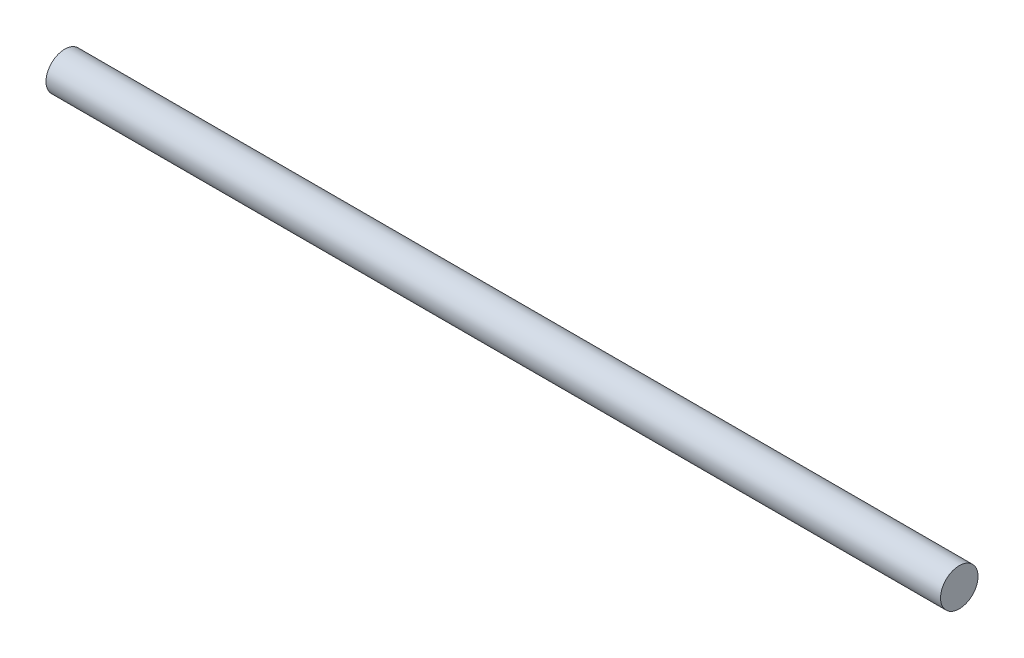
ISO-10303-21;
HEADER;
FILE_DESCRIPTION(('STEP AP214'),'2;1');
FILE_NAME('part.step','',(''),(''),'','','');
FILE_SCHEMA(('AUTOMOTIVE_DESIGN { 1 0 10303 214 1 1 1 1 }'));
ENDSEC;
DATA;
#1=APPLICATION_CONTEXT('core data for automotive mechanical design processes');
#2=APPLICATION_PROTOCOL_DEFINITION('international standard','automotive_design',2000,#1);
#3=PRODUCT_CONTEXT('',#1,'mechanical');
#4=PRODUCT('Part','Part','',(#3));
#5=PRODUCT_RELATED_PRODUCT_CATEGORY('part','',(#4));
#6=PRODUCT_DEFINITION_FORMATION('','',#4);
#7=PRODUCT_DEFINITION_CONTEXT('part definition',#1,'design');
#8=PRODUCT_DEFINITION('design','',#6,#7);
#9=PRODUCT_DEFINITION_SHAPE('','',#8);
#10=(LENGTH_UNIT() NAMED_UNIT(*) SI_UNIT(.MILLI.,.METRE.));
#11=(NAMED_UNIT(*) PLANE_ANGLE_UNIT() SI_UNIT($,.RADIAN.));
#12=(NAMED_UNIT(*) SI_UNIT($,.STERADIAN.) SOLID_ANGLE_UNIT());
#13=UNCERTAINTY_MEASURE_WITH_UNIT(LENGTH_MEASURE(1.E-05),#10,'distance_accuracy_value','');
#14=(GEOMETRIC_REPRESENTATION_CONTEXT(3) GLOBAL_UNCERTAINTY_ASSIGNED_CONTEXT((#13)) GLOBAL_UNIT_ASSIGNED_CONTEXT((#10,
#11,#12)) REPRESENTATION_CONTEXT('',''));
#15=CARTESIAN_POINT('',(0.,0.,0.));
#16=DIRECTION('',(0.,0.,1.));
#17=DIRECTION('',(1.,0.,0.));
#18=AXIS2_PLACEMENT_3D('',#15,#16,#17);
#19=CARTESIAN_POINT('',(424.18,0.,0.));
#20=DIRECTION('',(-1.,0.,0.));
#21=DIRECTION('',(0.,0.,1.));
#22=AXIS2_PLACEMENT_3D('',#19,#20,#21);
#23=CYLINDRICAL_SURFACE('',#22,8.89000000000001);
#24=CARTESIAN_POINT('',(424.18,0.,0.));
#25=DIRECTION('',(1.,0.,0.));
#26=DIRECTION('',(0.,0.,-1.));
#27=AXIS2_PLACEMENT_3D('',#24,#25,#26);
#28=CIRCLE('',#27,8.89000000000001);
#29=CARTESIAN_POINT('',(424.18,0.,8.89000000000001));
#30=VERTEX_POINT('',#29);
#31=EDGE_CURVE('E10',#30,#30,#28,.T.);
#32=CARTESIAN_POINT('',(0.,0.,0.));
#33=DIRECTION('',(1.,0.,0.));
#34=DIRECTION('',(0.,0.,-1.));
#35=AXIS2_PLACEMENT_3D('',#32,#33,#34);
#36=CIRCLE('',#35,8.89000000000001);
#37=CARTESIAN_POINT('',(0.,0.,8.89000000000001));
#38=VERTEX_POINT('',#37);
#39=EDGE_CURVE('E46',#38,#38,#36,.T.);
#40=CARTESIAN_POINT('',(424.18,0.,8.89000000000001));
#41=CARTESIAN_POINT('',(419.761458333333,0.,8.89000000000001));
#42=CARTESIAN_POINT('',(415.342916666667,0.,8.89000000000001));
#43=CARTESIAN_POINT('',(406.505833333333,0.,8.89000000000001));
#44=CARTESIAN_POINT('',(402.087291666667,0.,8.89000000000001));
#45=CARTESIAN_POINT('',(393.250208333333,0.,8.89000000000001));
#46=CARTESIAN_POINT('',(388.831666666667,0.,8.89000000000001));
#47=CARTESIAN_POINT('',(379.994583333333,0.,8.89000000000001));
#48=CARTESIAN_POINT('',(375.576041666667,0.,8.89000000000001));
#49=CARTESIAN_POINT('',(366.738958333333,0.,8.89000000000001));
#50=CARTESIAN_POINT('',(362.320416666667,0.,8.89000000000001));
#51=CARTESIAN_POINT('',(353.483333333333,0.,8.89000000000001));
#52=CARTESIAN_POINT('',(349.064791666667,0.,8.89000000000001));
#53=CARTESIAN_POINT('',(340.227708333333,0.,8.89000000000001));
#54=CARTESIAN_POINT('',(335.809166666667,0.,8.89000000000001));
#55=CARTESIAN_POINT('',(326.972083333333,0.,8.89000000000001));
#56=CARTESIAN_POINT('',(322.553541666667,0.,8.89000000000001));
#57=CARTESIAN_POINT('',(313.716458333333,0.,8.89000000000001));
#58=CARTESIAN_POINT('',(309.297916666667,0.,8.89000000000001));
#59=CARTESIAN_POINT('',(300.460833333333,0.,8.89000000000001));
#60=CARTESIAN_POINT('',(296.042291666667,0.,8.89000000000001));
#61=CARTESIAN_POINT('',(287.205208333333,0.,8.89000000000001));
#62=CARTESIAN_POINT('',(282.786666666667,0.,8.89000000000001));
#63=CARTESIAN_POINT('',(273.949583333333,0.,8.89000000000001));
#64=CARTESIAN_POINT('',(269.531041666667,0.,8.89000000000001));
#65=CARTESIAN_POINT('',(260.693958333333,0.,8.89000000000001));
#66=CARTESIAN_POINT('',(256.275416666667,0.,8.89000000000001));
#67=CARTESIAN_POINT('',(247.438333333333,0.,8.89000000000001));
#68=CARTESIAN_POINT('',(243.019791666667,0.,8.89000000000001));
#69=CARTESIAN_POINT('',(234.182708333333,0.,8.89000000000001));
#70=CARTESIAN_POINT('',(229.764166666667,0.,8.89000000000001));
#71=CARTESIAN_POINT('',(220.927083333333,0.,8.89000000000001));
#72=CARTESIAN_POINT('',(216.508541666667,0.,8.89000000000001));
#73=CARTESIAN_POINT('',(207.671458333333,0.,8.89000000000001));
#74=CARTESIAN_POINT('',(203.252916666667,0.,8.89000000000001));
#75=CARTESIAN_POINT('',(194.415833333333,0.,8.89000000000001));
#76=CARTESIAN_POINT('',(189.997291666667,0.,8.89000000000001));
#77=CARTESIAN_POINT('',(181.160208333333,0.,8.89000000000001));
#78=CARTESIAN_POINT('',(176.741666666667,0.,8.89000000000001));
#79=CARTESIAN_POINT('',(167.904583333333,0.,8.89000000000001));
#80=CARTESIAN_POINT('',(163.486041666667,0.,8.89000000000001));
#81=CARTESIAN_POINT('',(154.648958333333,0.,8.89000000000001));
#82=CARTESIAN_POINT('',(150.230416666667,0.,8.89000000000001));
#83=CARTESIAN_POINT('',(141.393333333333,0.,8.89000000000001));
#84=CARTESIAN_POINT('',(136.974791666667,0.,8.89000000000001));
#85=CARTESIAN_POINT('',(128.137708333333,0.,8.89000000000001));
#86=CARTESIAN_POINT('',(123.719166666667,0.,8.89000000000001));
#87=CARTESIAN_POINT('',(114.882083333333,0.,8.89000000000001));
#88=CARTESIAN_POINT('',(110.463541666667,0.,8.89000000000001));
#89=CARTESIAN_POINT('',(101.626458333333,0.,8.89000000000001));
#90=CARTESIAN_POINT('',(97.2079166666667,0.,8.89000000000001));
#91=CARTESIAN_POINT('',(88.3708333333333,0.,8.89000000000001));
#92=CARTESIAN_POINT('',(83.9522916666667,0.,8.89000000000001));
#93=CARTESIAN_POINT('',(75.1152083333334,0.,8.89000000000001));
#94=CARTESIAN_POINT('',(70.6966666666667,0.,8.89000000000001));
#95=CARTESIAN_POINT('',(61.8595833333333,0.,8.89000000000001));
#96=CARTESIAN_POINT('',(57.4410416666667,0.,8.89000000000001));
#97=CARTESIAN_POINT('',(48.6039583333333,0.,8.89000000000001));
#98=CARTESIAN_POINT('',(44.1854166666666,0.,8.89000000000001));
#99=CARTESIAN_POINT('',(35.3483333333333,0.,8.89000000000001));
#100=CARTESIAN_POINT('',(30.9297916666667,0.,8.89000000000001));
#101=CARTESIAN_POINT('',(22.0927083333333,0.,8.89000000000001));
#102=CARTESIAN_POINT('',(17.6741666666667,0.,8.89000000000001));
#103=CARTESIAN_POINT('',(8.83708333333333,0.,8.89000000000001));
#104=CARTESIAN_POINT('',(4.41854166666666,0.,8.89000000000001));
#105=CARTESIAN_POINT('',(0.,0.,8.89000000000001));
#106=B_SPLINE_CURVE_WITH_KNOTS('',3,(#40,#41,#42,#43,#44,#45,#46,#47,#48,#49,#50,#51,#52,#53,
#54,#55,#56,#57,#58,#59,#60,#61,#62,#63,#64,#65,#66,#67,#68,#69,#70,#71,#72,#73,#74,#75,#76,#77,
#78,#79,#80,#81,#82,#83,#84,#85,#86,#87,#88,#89,#90,#91,#92,#93,#94,#95,#96,#97,#98,#99,#100,
#101,#102,#103,#104,#105),.UNSPECIFIED.,.F.,.F.,(4,2,2,2,2,2,2,2,2,2,2,2,2,2,2,2,2,2,2,2,2,2,2,
2,2,2,2,2,2,2,2,2,4),(0.,13.255625,26.51125,39.766875,53.0225,66.278125,79.53375,92.789375,
106.045,119.300625,132.55625,145.811875,159.0675,172.323125,185.57875,198.834375,212.09,
225.345625,238.60125,251.856875,265.1125,278.368125,291.62375,304.879375,318.135,331.390625,
344.64625,357.901875,371.1575,384.413125,397.66875,410.924375,424.18),.UNSPECIFIED.);
#107=EDGE_CURVE('BSEAM43',#30,#38,#106,.T.);
#108=ORIENTED_EDGE('',*,*,#31,.F.);
#109=ORIENTED_EDGE('',*,*,#39,.T.);
#110=ORIENTED_EDGE('',*,*,#107,.T.);
#111=ORIENTED_EDGE('',*,*,#107,.F.);
#112=EDGE_LOOP('',(#108,#110,#109,#111));
#113=FACE_BOUND('',#112,.T.);
#114=ADVANCED_FACE('F43',(#113),#23,.T.);
#115=CARTESIAN_POINT('',(424.18,0.,0.));
#116=DIRECTION('',(1.,0.,0.));
#117=DIRECTION('',(0.,0.,-1.));
#118=AXIS2_PLACEMENT_3D('',#115,#116,#117);
#119=PLANE('',#118);
#120=ORIENTED_EDGE('',*,*,#31,.T.);
#121=EDGE_LOOP('',(#120));
#122=FACE_BOUND('',#121,.T.);
#123=ADVANCED_FACE('F60',(#122),#119,.T.);
#124=CARTESIAN_POINT('',(0.,0.,0.));
#125=DIRECTION('',(1.,0.,0.));
#126=DIRECTION('',(0.,0.,-1.));
#127=AXIS2_PLACEMENT_3D('',#124,#125,#126);
#128=PLANE('',#127);
#129=ORIENTED_EDGE('',*,*,#39,.F.);
#130=EDGE_LOOP('',(#129));
#131=FACE_BOUND('',#130,.T.);
#132=ADVANCED_FACE('F58',(#131),#128,.F.);
#133=CLOSED_SHELL('',(#114,#123,#132));
#134=MANIFOLD_SOLID_BREP('B2',#133);
#135=ADVANCED_BREP_SHAPE_REPRESENTATION('',(#18,#134),#14);
#136=SHAPE_DEFINITION_REPRESENTATION(#9,#135);
ENDSEC;
END-ISO-10303-21;
